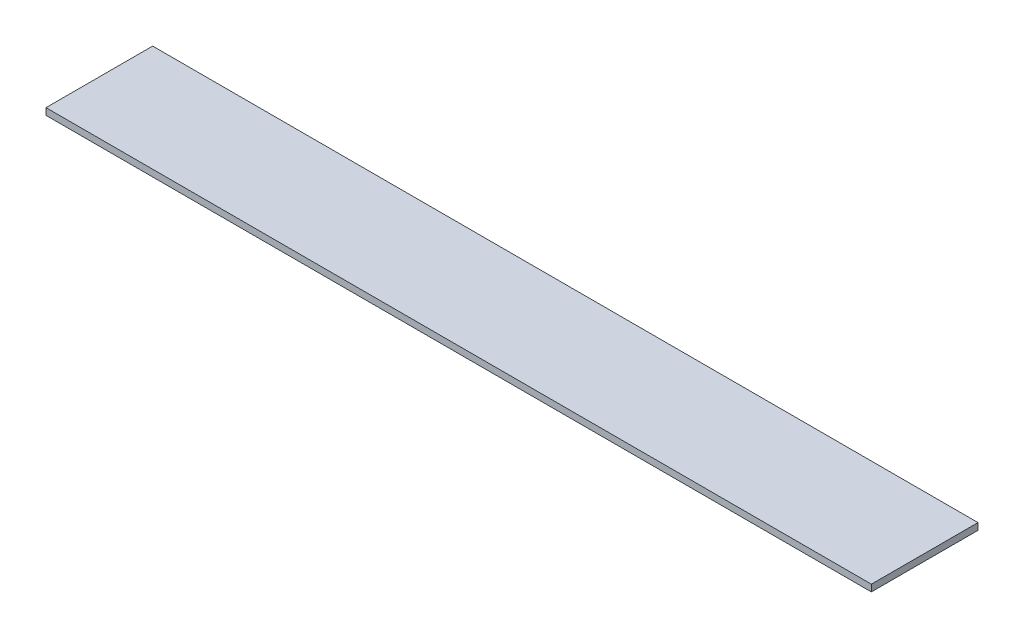
ISO-10303-21;
HEADER;
FILE_DESCRIPTION(('STEP AP214'),'2;1');
FILE_NAME('part.step','',(''),(''),'','','');
FILE_SCHEMA(('AUTOMOTIVE_DESIGN { 1 0 10303 214 1 1 1 1 }'));
ENDSEC;
DATA;
#1=APPLICATION_CONTEXT('core data for automotive mechanical design processes');
#2=APPLICATION_PROTOCOL_DEFINITION('international standard','automotive_design',2000,#1);
#3=PRODUCT_CONTEXT('',#1,'mechanical');
#4=PRODUCT('Part','Part','',(#3));
#5=PRODUCT_RELATED_PRODUCT_CATEGORY('part','',(#4));
#6=PRODUCT_DEFINITION_FORMATION('','',#4);
#7=PRODUCT_DEFINITION_CONTEXT('part definition',#1,'design');
#8=PRODUCT_DEFINITION('design','',#6,#7);
#9=PRODUCT_DEFINITION_SHAPE('','',#8);
#10=(LENGTH_UNIT() NAMED_UNIT(*) SI_UNIT(.MILLI.,.METRE.));
#11=(NAMED_UNIT(*) PLANE_ANGLE_UNIT() SI_UNIT($,.RADIAN.));
#12=(NAMED_UNIT(*) SI_UNIT($,.STERADIAN.) SOLID_ANGLE_UNIT());
#13=UNCERTAINTY_MEASURE_WITH_UNIT(LENGTH_MEASURE(1.E-05),#10,'distance_accuracy_value','');
#14=(GEOMETRIC_REPRESENTATION_CONTEXT(3) GLOBAL_UNCERTAINTY_ASSIGNED_CONTEXT((#13)) GLOBAL_UNIT_ASSIGNED_CONTEXT((#10,
#11,#12)) REPRESENTATION_CONTEXT('',''));
#15=CARTESIAN_POINT('',(0.,0.,0.));
#16=DIRECTION('',(0.,0.,1.));
#17=DIRECTION('',(1.,0.,0.));
#18=AXIS2_PLACEMENT_3D('',#15,#16,#17);
#19=CARTESIAN_POINT('',(0.,2.54,0.));
#20=DIRECTION('',(1.,0.,0.));
#21=DIRECTION('',(0.,0.,-1.));
#22=AXIS2_PLACEMENT_3D('',#19,#20,#21);
#23=PLANE('',#22);
#24=DIRECTION('',(0.,0.,1.));
#25=VECTOR('',#24,1.);
#26=CARTESIAN_POINT('',(0.,0.,0.));
#27=LINE('',#26,#25);
#28=CARTESIAN_POINT('',(0.,0.,-40.2));
#29=VERTEX_POINT('',#28);
#30=CARTESIAN_POINT('',(0.,0.,0.));
#31=VERTEX_POINT('',#30);
#32=EDGE_CURVE('E96',#29,#31,#27,.T.);
#33=ORIENTED_EDGE('',*,*,#32,.T.);
#34=DIRECTION('',(0.,-1.,0.));
#35=VECTOR('',#34,1.);
#36=CARTESIAN_POINT('',(0.,2.54,0.));
#37=LINE('',#36,#35);
#38=CARTESIAN_POINT('',(0.,2.54,0.));
#39=VERTEX_POINT('',#38);
#40=EDGE_CURVE('E11',#39,#31,#37,.T.);
#41=ORIENTED_EDGE('',*,*,#40,.F.);
#42=DIRECTION('',(0.,0.,1.));
#43=VECTOR('',#42,1.);
#44=CARTESIAN_POINT('',(0.,2.54,0.));
#45=LINE('',#44,#43);
#46=CARTESIAN_POINT('',(0.,2.54,-40.2));
#47=VERTEX_POINT('',#46);
#48=EDGE_CURVE('E84',#47,#39,#45,.T.);
#49=ORIENTED_EDGE('',*,*,#48,.F.);
#50=DIRECTION('',(0.,-1.,0.));
#51=VECTOR('',#50,1.);
#52=CARTESIAN_POINT('',(0.,2.54,-40.2));
#53=LINE('',#52,#51);
#54=EDGE_CURVE('E92',#47,#29,#53,.T.);
#55=ORIENTED_EDGE('',*,*,#54,.T.);
#56=EDGE_LOOP('',(#33,#41,#49,#55));
#57=FACE_BOUND('',#56,.T.);
#58=ADVANCED_FACE('F33',(#57),#23,.F.);
#59=CARTESIAN_POINT('',(0.,2.54,0.));
#60=DIRECTION('',(0.,0.,-1.));
#61=DIRECTION('',(-1.,0.,0.));
#62=AXIS2_PLACEMENT_3D('',#59,#60,#61);
#63=PLANE('',#62);
#64=DIRECTION('',(1.,0.,0.));
#65=VECTOR('',#64,1.);
#66=CARTESIAN_POINT('',(0.,0.,0.));
#67=LINE('',#66,#65);
#68=CARTESIAN_POINT('',(311.15,0.,0.));
#69=VERTEX_POINT('',#68);
#70=EDGE_CURVE('E88',#31,#69,#67,.T.);
#71=ORIENTED_EDGE('',*,*,#70,.T.);
#72=DIRECTION('',(0.,-1.,0.));
#73=VECTOR('',#72,1.);
#74=CARTESIAN_POINT('',(311.15,2.54,0.));
#75=LINE('',#74,#73);
#76=CARTESIAN_POINT('',(311.15,2.54,0.));
#77=VERTEX_POINT('',#76);
#78=EDGE_CURVE('E41',#77,#69,#75,.T.);
#79=ORIENTED_EDGE('',*,*,#78,.F.);
#80=DIRECTION('',(1.,0.,0.));
#81=VECTOR('',#80,1.);
#82=CARTESIAN_POINT('',(0.,2.54,0.));
#83=LINE('',#82,#81);
#84=EDGE_CURVE('E79',#39,#77,#83,.T.);
#85=ORIENTED_EDGE('',*,*,#84,.F.);
#86=ORIENTED_EDGE('',*,*,#40,.T.);
#87=EDGE_LOOP('',(#71,#79,#85,#86));
#88=FACE_BOUND('',#87,.T.);
#89=ADVANCED_FACE('F87',(#88),#63,.F.);
#90=CARTESIAN_POINT('',(311.15,2.54,0.));
#91=DIRECTION('',(-1.,0.,0.));
#92=DIRECTION('',(0.,0.,1.));
#93=AXIS2_PLACEMENT_3D('',#90,#91,#92);
#94=PLANE('',#93);
#95=DIRECTION('',(0.,0.,-1.));
#96=VECTOR('',#95,1.);
#97=CARTESIAN_POINT('',(311.15,0.,0.));
#98=LINE('',#97,#96);
#99=CARTESIAN_POINT('',(311.15,0.,-40.2));
#100=VERTEX_POINT('',#99);
#101=EDGE_CURVE('E66',#69,#100,#98,.T.);
#102=ORIENTED_EDGE('',*,*,#101,.T.);
#103=DIRECTION('',(0.,-1.,0.));
#104=VECTOR('',#103,1.);
#105=CARTESIAN_POINT('',(311.15,2.54,-40.2));
#106=LINE('',#105,#104);
#107=CARTESIAN_POINT('',(311.15,2.54,-40.2));
#108=VERTEX_POINT('',#107);
#109=EDGE_CURVE('E89',#108,#100,#106,.T.);
#110=ORIENTED_EDGE('',*,*,#109,.F.);
#111=DIRECTION('',(0.,0.,-1.));
#112=VECTOR('',#111,1.);
#113=CARTESIAN_POINT('',(311.15,2.54,0.));
#114=LINE('',#113,#112);
#115=EDGE_CURVE('E82',#77,#108,#114,.T.);
#116=ORIENTED_EDGE('',*,*,#115,.F.);
#117=ORIENTED_EDGE('',*,*,#78,.T.);
#118=EDGE_LOOP('',(#102,#110,#116,#117));
#119=FACE_BOUND('',#118,.T.);
#120=ADVANCED_FACE('F90',(#119),#94,.F.);
#121=CARTESIAN_POINT('',(0.,2.54,-40.2));
#122=DIRECTION('',(0.,0.,1.));
#123=DIRECTION('',(1.,0.,0.));
#124=AXIS2_PLACEMENT_3D('',#121,#122,#123);
#125=PLANE('',#124);
#126=DIRECTION('',(-1.,0.,0.));
#127=VECTOR('',#126,1.);
#128=CARTESIAN_POINT('',(0.,0.,-40.2));
#129=LINE('',#128,#127);
#130=EDGE_CURVE('E72',#100,#29,#129,.T.);
#131=ORIENTED_EDGE('',*,*,#130,.T.);
#132=ORIENTED_EDGE('',*,*,#54,.F.);
#133=DIRECTION('',(-1.,0.,0.));
#134=VECTOR('',#133,1.);
#135=CARTESIAN_POINT('',(0.,2.54,-40.2));
#136=LINE('',#135,#134);
#137=EDGE_CURVE('E49',#108,#47,#136,.T.);
#138=ORIENTED_EDGE('',*,*,#137,.F.);
#139=ORIENTED_EDGE('',*,*,#109,.T.);
#140=EDGE_LOOP('',(#131,#132,#138,#139));
#141=FACE_BOUND('',#140,.T.);
#142=ADVANCED_FACE('F103',(#141),#125,.F.);
#143=CARTESIAN_POINT('',(0.,2.54,0.));
#144=DIRECTION('',(0.,-1.,0.));
#145=DIRECTION('',(0.,0.,-1.));
#146=AXIS2_PLACEMENT_3D('',#143,#144,#145);
#147=PLANE('',#146);
#148=ORIENTED_EDGE('',*,*,#48,.T.);
#149=ORIENTED_EDGE('',*,*,#84,.T.);
#150=ORIENTED_EDGE('',*,*,#115,.T.);
#151=ORIENTED_EDGE('',*,*,#137,.T.);
#152=EDGE_LOOP('',(#148,#149,#150,#151));
#153=FACE_BOUND('',#152,.T.);
#154=ADVANCED_FACE('F80',(#153),#147,.F.);
#155=CARTESIAN_POINT('',(0.,0.,0.));
#156=DIRECTION('',(0.,-1.,0.));
#157=DIRECTION('',(0.,0.,-1.));
#158=AXIS2_PLACEMENT_3D('',#155,#156,#157);
#159=PLANE('',#158);
#160=ORIENTED_EDGE('',*,*,#32,.F.);
#161=ORIENTED_EDGE('',*,*,#130,.F.);
#162=ORIENTED_EDGE('',*,*,#101,.F.);
#163=ORIENTED_EDGE('',*,*,#70,.F.);
#164=EDGE_LOOP('',(#160,#161,#162,#163));
#165=FACE_BOUND('',#164,.T.);
#166=ADVANCED_FACE('F106',(#165),#159,.T.);
#167=CLOSED_SHELL('',(#58,#89,#120,#142,#154,#166));
#168=MANIFOLD_SOLID_BREP('B2',#167);
#169=ADVANCED_BREP_SHAPE_REPRESENTATION('',(#18,#168),#14);
#170=SHAPE_DEFINITION_REPRESENTATION(#9,#169);
ENDSEC;
END-ISO-10303-21;
